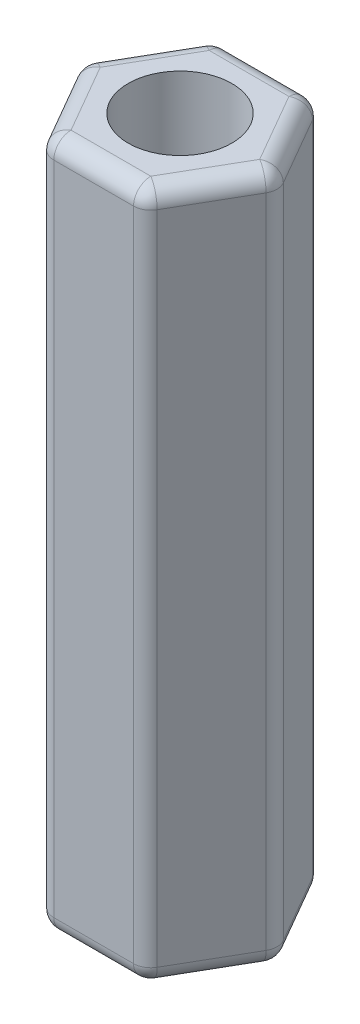
ISO-10303-21;
HEADER;
FILE_DESCRIPTION(('STEP AP214'),'2;1');
FILE_NAME('part.step','',(''),(''),'','','');
FILE_SCHEMA(('AUTOMOTIVE_DESIGN { 1 0 10303 214 1 1 1 1 }'));
ENDSEC;
DATA;
#1=APPLICATION_CONTEXT('core data for automotive mechanical design processes');
#2=APPLICATION_PROTOCOL_DEFINITION('international standard','automotive_design',2000,#1);
#3=PRODUCT_CONTEXT('',#1,'mechanical');
#4=PRODUCT('Part','Part','',(#3));
#5=PRODUCT_RELATED_PRODUCT_CATEGORY('part','',(#4));
#6=PRODUCT_DEFINITION_FORMATION('','',#4);
#7=PRODUCT_DEFINITION_CONTEXT('part definition',#1,'design');
#8=PRODUCT_DEFINITION('design','',#6,#7);
#9=PRODUCT_DEFINITION_SHAPE('','',#8);
#10=(LENGTH_UNIT() NAMED_UNIT(*) SI_UNIT(.MILLI.,.METRE.));
#11=(NAMED_UNIT(*) PLANE_ANGLE_UNIT() SI_UNIT($,.RADIAN.));
#12=(NAMED_UNIT(*) SI_UNIT($,.STERADIAN.) SOLID_ANGLE_UNIT());
#13=UNCERTAINTY_MEASURE_WITH_UNIT(LENGTH_MEASURE(1.E-05),#10,'distance_accuracy_value','');
#14=(GEOMETRIC_REPRESENTATION_CONTEXT(3) GLOBAL_UNCERTAINTY_ASSIGNED_CONTEXT((#13)) GLOBAL_UNIT_ASSIGNED_CONTEXT((#10,
#11,#12)) REPRESENTATION_CONTEXT('',''));
#15=CARTESIAN_POINT('',(0.,0.,0.));
#16=DIRECTION('',(0.,0.,1.));
#17=DIRECTION('',(1.,0.,0.));
#18=AXIS2_PLACEMENT_3D('',#15,#16,#17);
#19=CARTESIAN_POINT('',(-1.44337567297407,20.,-2.5));
#20=DIRECTION('',(0.,1.,0.));
#21=DIRECTION('',(0.,0.,1.));
#22=AXIS2_PLACEMENT_3D('',#19,#20,#21);
#23=PLANE('',#22);
#24=DIRECTION('',(-1.,0.,0.));
#25=VECTOR('',#24,1.);
#26=CARTESIAN_POINT('',(-1.44337567297406,20.,-2.));
#27=LINE('',#26,#25);
#28=CARTESIAN_POINT('',(1.15470053837925,20.,-2.));
#29=VERTEX_POINT('',#28);
#30=CARTESIAN_POINT('',(-1.15470053837925,20.,-2.));
#31=VERTEX_POINT('',#30);
#32=EDGE_CURVE('E248',#29,#31,#27,.T.);
#33=ORIENTED_EDGE('',*,*,#32,.T.);
#34=DIRECTION('',(-0.5,0.,0.866025403784439));
#35=VECTOR('',#34,1.);
#36=CARTESIAN_POINT('',(-2.45373864405591,20.,0.250000000000001));
#37=LINE('',#36,#35);
#38=CARTESIAN_POINT('',(-2.30940107675851,20.,0.));
#39=VERTEX_POINT('',#38);
#40=EDGE_CURVE('E160',#31,#39,#37,.T.);
#41=ORIENTED_EDGE('',*,*,#40,.T.);
#42=DIRECTION('',(0.5,0.,0.866025403784439));
#43=VECTOR('',#42,1.);
#44=CARTESIAN_POINT('',(-1.01036297108185,20.,2.25));
#45=LINE('',#44,#43);
#46=CARTESIAN_POINT('',(-1.15470053837925,20.,2.));
#47=VERTEX_POINT('',#46);
#48=EDGE_CURVE('E153',#39,#47,#45,.T.);
#49=ORIENTED_EDGE('',*,*,#48,.T.);
#50=DIRECTION('',(1.,0.,0.));
#51=VECTOR('',#50,1.);
#52=CARTESIAN_POINT('',(1.44337567297407,20.,2.));
#53=LINE('',#52,#51);
#54=CARTESIAN_POINT('',(1.15470053837925,20.,2.));
#55=VERTEX_POINT('',#54);
#56=EDGE_CURVE('E157',#47,#55,#53,.T.);
#57=ORIENTED_EDGE('',*,*,#56,.T.);
#58=DIRECTION('',(0.5,0.,-0.866025403784439));
#59=VECTOR('',#58,1.);
#60=CARTESIAN_POINT('',(2.45373864405591,20.,-0.249999999999999));
#61=LINE('',#60,#59);
#62=CARTESIAN_POINT('',(2.30940107675851,20.,0.));
#63=VERTEX_POINT('',#62);
#64=EDGE_CURVE('E165',#55,#63,#61,.T.);
#65=ORIENTED_EDGE('',*,*,#64,.T.);
#66=DIRECTION('',(-0.5,0.,-0.866025403784439));
#67=VECTOR('',#66,1.);
#68=CARTESIAN_POINT('',(1.01036297108185,20.,-2.25));
#69=LINE('',#68,#67);
#70=EDGE_CURVE('E246',#63,#29,#69,.T.);
#71=ORIENTED_EDGE('',*,*,#70,.T.);
#72=EDGE_LOOP('',(#33,#41,#49,#57,#65,#71));
#73=FACE_BOUND('',#72,.T.);
#74=CARTESIAN_POINT('',(0.,20.,0.));
#75=DIRECTION('',(0.,1.,0.));
#76=DIRECTION('',(0.,0.,1.));
#77=AXIS2_PLACEMENT_3D('',#74,#75,#76);
#78=CIRCLE('',#77,1.5);
#79=CARTESIAN_POINT('',(0.,20.,1.5));
#80=VERTEX_POINT('',#79);
#81=EDGE_CURVE('E176',#80,#80,#78,.T.);
#82=ORIENTED_EDGE('',*,*,#81,.F.);
#83=EDGE_LOOP('',(#82));
#84=FACE_BOUND('',#83,.T.);
#85=ADVANCED_FACE('F30',(#73,#84),#23,.T.);
#86=CARTESIAN_POINT('',(-1.44337567297407,0.,-2.5));
#87=DIRECTION('',(0.,1.,0.));
#88=DIRECTION('',(0.,0.,1.));
#89=AXIS2_PLACEMENT_3D('',#86,#87,#88);
#90=PLANE('',#89);
#91=DIRECTION('',(0.5,0.,0.866025403784439));
#92=VECTOR('',#91,1.);
#93=CARTESIAN_POINT('',(-3.17542648054295,0.,-1.5));
#94=LINE('',#93,#92);
#95=CARTESIAN_POINT('',(-1.15470053837925,0.,2.));
#96=VERTEX_POINT('',#95);
#97=CARTESIAN_POINT('',(-2.30940107675851,0.,0.));
#98=VERTEX_POINT('',#97);
#99=EDGE_CURVE('E262',#96,#98,#94,.F.);
#100=ORIENTED_EDGE('',*,*,#99,.T.);
#101=DIRECTION('',(-0.5,0.,0.866025403784439));
#102=VECTOR('',#101,1.);
#103=CARTESIAN_POINT('',(-1.01036297108185,0.,-2.25));
#104=LINE('',#103,#102);
#105=CARTESIAN_POINT('',(-1.15470053837925,0.,-2.));
#106=VERTEX_POINT('',#105);
#107=EDGE_CURVE('E271',#98,#106,#104,.F.);
#108=ORIENTED_EDGE('',*,*,#107,.T.);
#109=DIRECTION('',(-1.,0.,0.));
#110=VECTOR('',#109,1.);
#111=CARTESIAN_POINT('',(-1.44337567297407,0.,-2.));
#112=LINE('',#111,#110);
#113=CARTESIAN_POINT('',(1.15470053837925,0.,-2.));
#114=VERTEX_POINT('',#113);
#115=EDGE_CURVE('E268',#106,#114,#112,.F.);
#116=ORIENTED_EDGE('',*,*,#115,.T.);
#117=DIRECTION('',(-0.5,0.,-0.866025403784439));
#118=VECTOR('',#117,1.);
#119=CARTESIAN_POINT('',(0.288675134594814,0.,-3.5));
#120=LINE('',#119,#118);
#121=CARTESIAN_POINT('',(2.30940107675851,0.,0.));
#122=VERTEX_POINT('',#121);
#123=EDGE_CURVE('E266',#114,#122,#120,.F.);
#124=ORIENTED_EDGE('',*,*,#123,.T.);
#125=DIRECTION('',(0.5,0.,-0.866025403784439));
#126=VECTOR('',#125,1.);
#127=CARTESIAN_POINT('',(2.45373864405591,0.,-0.249999999999999));
#128=LINE('',#127,#126);
#129=CARTESIAN_POINT('',(1.15470053837925,0.,2.));
#130=VERTEX_POINT('',#129);
#131=EDGE_CURVE('E264',#122,#130,#128,.F.);
#132=ORIENTED_EDGE('',*,*,#131,.T.);
#133=DIRECTION('',(1.,0.,0.));
#134=VECTOR('',#133,1.);
#135=CARTESIAN_POINT('',(-1.44337567297407,0.,2.));
#136=LINE('',#135,#134);
#137=EDGE_CURVE('E260',#130,#96,#136,.F.);
#138=ORIENTED_EDGE('',*,*,#137,.T.);
#139=EDGE_LOOP('',(#100,#108,#116,#124,#132,#138));
#140=FACE_BOUND('',#139,.T.);
#141=CARTESIAN_POINT('',(0.,0.,0.));
#142=DIRECTION('',(0.,1.,0.));
#143=DIRECTION('',(0.,0.,1.));
#144=AXIS2_PLACEMENT_3D('',#141,#142,#143);
#145=CIRCLE('',#144,1.5);
#146=CARTESIAN_POINT('',(0.,0.,1.5));
#147=VERTEX_POINT('',#146);
#148=EDGE_CURVE('E233',#147,#147,#145,.T.);
#149=ORIENTED_EDGE('',*,*,#148,.T.);
#150=EDGE_LOOP('',(#149));
#151=FACE_BOUND('',#150,.T.);
#152=ADVANCED_FACE('F420',(#140,#151),#90,.F.);
#153=CARTESIAN_POINT('',(1.44337567297407,20.,-2.5));
#154=DIRECTION('',(0.,0.,1.));
#155=DIRECTION('',(1.,0.,0.));
#156=AXIS2_PLACEMENT_3D('',#153,#154,#155);
#157=PLANE('',#156);
#158=DIRECTION('',(-1.,0.,0.));
#159=VECTOR('',#158,1.);
#160=CARTESIAN_POINT('',(1.44337567297407,19.5,-2.5));
#161=LINE('',#160,#159);
#162=CARTESIAN_POINT('',(-1.15470053837925,19.5,-2.5));
#163=VERTEX_POINT('',#162);
#164=CARTESIAN_POINT('',(1.15470053837925,19.5,-2.5));
#165=VERTEX_POINT('',#164);
#166=EDGE_CURVE('E255',#163,#165,#161,.F.);
#167=ORIENTED_EDGE('',*,*,#166,.T.);
#168=DIRECTION('',(0.,-1.,0.));
#169=VECTOR('',#168,1.);
#170=CARTESIAN_POINT('',(1.15470053837925,20.,-2.5));
#171=LINE('',#170,#169);
#172=CARTESIAN_POINT('',(1.15470053837925,0.5,-2.5));
#173=VERTEX_POINT('',#172);
#174=EDGE_CURVE('E258',#165,#173,#171,.T.);
#175=ORIENTED_EDGE('',*,*,#174,.T.);
#176=DIRECTION('',(-1.,0.,0.));
#177=VECTOR('',#176,1.);
#178=CARTESIAN_POINT('',(1.44337567297407,0.5,-2.5));
#179=LINE('',#178,#177);
#180=CARTESIAN_POINT('',(-1.15470053837925,0.5,-2.5));
#181=VERTEX_POINT('',#180);
#182=EDGE_CURVE('E253',#173,#181,#179,.T.);
#183=ORIENTED_EDGE('',*,*,#182,.T.);
#184=DIRECTION('',(0.,-1.,0.));
#185=VECTOR('',#184,1.);
#186=CARTESIAN_POINT('',(-1.15470053837925,20.,-2.5));
#187=LINE('',#186,#185);
#188=EDGE_CURVE('E251',#181,#163,#187,.F.);
#189=ORIENTED_EDGE('',*,*,#188,.T.);
#190=EDGE_LOOP('',(#167,#175,#183,#189));
#191=FACE_BOUND('',#190,.T.);
#192=ADVANCED_FACE('F395',(#191),#157,.F.);
#193=CARTESIAN_POINT('',(-1.44337567297406,20.,-2.5));
#194=DIRECTION('',(0.866025403784438,0.,0.5));
#195=DIRECTION('',(0.5,0.,-0.866025403784439));
#196=AXIS2_PLACEMENT_3D('',#193,#194,#195);
#197=PLANE('',#196);
#198=DIRECTION('',(-0.5,0.,0.866025403784439));
#199=VECTOR('',#198,1.);
#200=CARTESIAN_POINT('',(-1.44337567297406,19.5,-2.5));
#201=LINE('',#200,#199);
#202=CARTESIAN_POINT('',(-2.74241377865073,19.5,-0.250000000000001));
#203=VERTEX_POINT('',#202);
#204=CARTESIAN_POINT('',(-1.58771324027147,19.5,-2.25));
#205=VERTEX_POINT('',#204);
#206=EDGE_CURVE('E302',#203,#205,#201,.F.);
#207=ORIENTED_EDGE('',*,*,#206,.T.);
#208=DIRECTION('',(0.,-1.,0.));
#209=VECTOR('',#208,1.);
#210=CARTESIAN_POINT('',(-1.58771324027147,20.,-2.25));
#211=LINE('',#210,#209);
#212=CARTESIAN_POINT('',(-1.58771324027147,0.5,-2.25));
#213=VERTEX_POINT('',#212);
#214=EDGE_CURVE('E304',#205,#213,#211,.T.);
#215=ORIENTED_EDGE('',*,*,#214,.T.);
#216=DIRECTION('',(-0.5,0.,0.866025403784439));
#217=VECTOR('',#216,1.);
#218=CARTESIAN_POINT('',(-1.44337567297406,0.5,-2.5));
#219=LINE('',#218,#217);
#220=CARTESIAN_POINT('',(-2.74241377865073,0.5,-0.250000000000001));
#221=VERTEX_POINT('',#220);
#222=EDGE_CURVE('E298',#213,#221,#219,.T.);
#223=ORIENTED_EDGE('',*,*,#222,.T.);
#224=DIRECTION('',(0.,-1.,0.));
#225=VECTOR('',#224,1.);
#226=CARTESIAN_POINT('',(-2.74241377865073,20.,-0.250000000000001));
#227=LINE('',#226,#225);
#228=EDGE_CURVE('E300',#221,#203,#227,.F.);
#229=ORIENTED_EDGE('',*,*,#228,.T.);
#230=EDGE_LOOP('',(#207,#215,#223,#229));
#231=FACE_BOUND('',#230,.T.);
#232=ADVANCED_FACE('F375',(#231),#197,.F.);
#233=CARTESIAN_POINT('',(-2.88675134594813,20.,0.));
#234=DIRECTION('',(0.866025403784439,0.,-0.5));
#235=DIRECTION('',(-0.5,0.,-0.866025403784439));
#236=AXIS2_PLACEMENT_3D('',#233,#234,#235);
#237=PLANE('',#236);
#238=DIRECTION('',(0.5,0.,0.866025403784439));
#239=VECTOR('',#238,1.);
#240=CARTESIAN_POINT('',(-2.88675134594813,19.5,0.));
#241=LINE('',#240,#239);
#242=CARTESIAN_POINT('',(-1.58771324027147,19.5,2.25));
#243=VERTEX_POINT('',#242);
#244=CARTESIAN_POINT('',(-2.74241377865073,19.5,0.25));
#245=VERTEX_POINT('',#244);
#246=EDGE_CURVE('E188',#243,#245,#241,.F.);
#247=ORIENTED_EDGE('',*,*,#246,.T.);
#248=DIRECTION('',(0.,-1.,0.));
#249=VECTOR('',#248,1.);
#250=CARTESIAN_POINT('',(-2.74241377865073,20.,0.25));
#251=LINE('',#250,#249);
#252=CARTESIAN_POINT('',(-2.74241377865073,0.5,0.25));
#253=VERTEX_POINT('',#252);
#254=EDGE_CURVE('E296',#245,#253,#251,.T.);
#255=ORIENTED_EDGE('',*,*,#254,.T.);
#256=DIRECTION('',(0.5,0.,0.866025403784439));
#257=VECTOR('',#256,1.);
#258=CARTESIAN_POINT('',(-2.88675134594813,0.5,0.));
#259=LINE('',#258,#257);
#260=CARTESIAN_POINT('',(-1.58771324027147,0.5,2.25));
#261=VERTEX_POINT('',#260);
#262=EDGE_CURVE('E293',#253,#261,#259,.T.);
#263=ORIENTED_EDGE('',*,*,#262,.T.);
#264=DIRECTION('',(0.,-1.,0.));
#265=VECTOR('',#264,1.);
#266=CARTESIAN_POINT('',(-1.58771324027147,20.,2.25));
#267=LINE('',#266,#265);
#268=EDGE_CURVE('E291',#261,#243,#267,.F.);
#269=ORIENTED_EDGE('',*,*,#268,.T.);
#270=EDGE_LOOP('',(#247,#255,#263,#269));
#271=FACE_BOUND('',#270,.T.);
#272=ADVANCED_FACE('F441',(#271),#237,.F.);
#273=CARTESIAN_POINT('',(-1.44337567297407,20.,2.5));
#274=DIRECTION('',(0.,0.,-1.));
#275=DIRECTION('',(-1.,0.,0.));
#276=AXIS2_PLACEMENT_3D('',#273,#274,#275);
#277=PLANE('',#276);
#278=DIRECTION('',(1.,0.,0.));
#279=VECTOR('',#278,1.);
#280=CARTESIAN_POINT('',(-1.44337567297407,19.5,2.5));
#281=LINE('',#280,#279);
#282=CARTESIAN_POINT('',(1.15470053837925,19.5,2.5));
#283=VERTEX_POINT('',#282);
#284=CARTESIAN_POINT('',(-1.15470053837925,19.5,2.5));
#285=VERTEX_POINT('',#284);
#286=EDGE_CURVE('E39',#283,#285,#281,.F.);
#287=ORIENTED_EDGE('',*,*,#286,.T.);
#288=DIRECTION('',(0.,-1.,0.));
#289=VECTOR('',#288,1.);
#290=CARTESIAN_POINT('',(-1.15470053837925,20.,2.5));
#291=LINE('',#290,#289);
#292=CARTESIAN_POINT('',(-1.15470053837925,0.5,2.5));
#293=VERTEX_POINT('',#292);
#294=EDGE_CURVE('E11',#285,#293,#291,.T.);
#295=ORIENTED_EDGE('',*,*,#294,.T.);
#296=DIRECTION('',(1.,0.,0.));
#297=VECTOR('',#296,1.);
#298=CARTESIAN_POINT('',(-1.44337567297407,0.5,2.5));
#299=LINE('',#298,#297);
#300=CARTESIAN_POINT('',(1.15470053837925,0.5,2.5));
#301=VERTEX_POINT('',#300);
#302=EDGE_CURVE('E307',#293,#301,#299,.T.);
#303=ORIENTED_EDGE('',*,*,#302,.T.);
#304=DIRECTION('',(0.,-1.,0.));
#305=VECTOR('',#304,1.);
#306=CARTESIAN_POINT('',(1.15470053837925,20.,2.5));
#307=LINE('',#306,#305);
#308=EDGE_CURVE('E50',#301,#283,#307,.F.);
#309=ORIENTED_EDGE('',*,*,#308,.T.);
#310=EDGE_LOOP('',(#287,#295,#303,#309));
#311=FACE_BOUND('',#310,.T.);
#312=ADVANCED_FACE('F437',(#311),#277,.F.);
#313=CARTESIAN_POINT('',(1.44337567297407,20.,2.5));
#314=DIRECTION('',(-0.866025403784438,0.,-0.5));
#315=DIRECTION('',(-0.5,0.,0.866025403784439));
#316=AXIS2_PLACEMENT_3D('',#313,#314,#315);
#317=PLANE('',#316);
#318=DIRECTION('',(0.,-1.,0.));
#319=VECTOR('',#318,1.);
#320=CARTESIAN_POINT('',(2.74241377865073,20.,0.250000000000002));
#321=LINE('',#320,#319);
#322=CARTESIAN_POINT('',(2.74241377865073,0.5,0.250000000000002));
#323=VERTEX_POINT('',#322);
#324=CARTESIAN_POINT('',(2.74241377865073,19.5,0.250000000000002));
#325=VERTEX_POINT('',#324);
#326=EDGE_CURVE('E286',#323,#325,#321,.F.);
#327=ORIENTED_EDGE('',*,*,#326,.T.);
#328=DIRECTION('',(0.5,0.,-0.866025403784439));
#329=VECTOR('',#328,1.);
#330=CARTESIAN_POINT('',(1.44337567297407,19.5,2.5));
#331=LINE('',#330,#329);
#332=CARTESIAN_POINT('',(1.58771324027147,19.5,2.25));
#333=VERTEX_POINT('',#332);
#334=EDGE_CURVE('E288',#325,#333,#331,.F.);
#335=ORIENTED_EDGE('',*,*,#334,.T.);
#336=DIRECTION('',(0.,-1.,0.));
#337=VECTOR('',#336,1.);
#338=CARTESIAN_POINT('',(1.58771324027147,20.,2.25));
#339=LINE('',#338,#337);
#340=CARTESIAN_POINT('',(1.58771324027147,0.5,2.25));
#341=VERTEX_POINT('',#340);
#342=EDGE_CURVE('E282',#333,#341,#339,.T.);
#343=ORIENTED_EDGE('',*,*,#342,.T.);
#344=DIRECTION('',(0.5,0.,-0.866025403784439));
#345=VECTOR('',#344,1.);
#346=CARTESIAN_POINT('',(1.44337567297407,0.5,2.5));
#347=LINE('',#346,#345);
#348=EDGE_CURVE('E284',#341,#323,#347,.T.);
#349=ORIENTED_EDGE('',*,*,#348,.T.);
#350=EDGE_LOOP('',(#327,#335,#343,#349));
#351=FACE_BOUND('',#350,.T.);
#352=ADVANCED_FACE('F433',(#351),#317,.F.);
#353=CARTESIAN_POINT('',(2.88675134594813,20.,0.));
#354=DIRECTION('',(-0.866025403784439,0.,0.5));
#355=DIRECTION('',(0.5,0.,0.866025403784439));
#356=AXIS2_PLACEMENT_3D('',#353,#354,#355);
#357=PLANE('',#356);
#358=DIRECTION('',(0.,-1.,0.));
#359=VECTOR('',#358,1.);
#360=CARTESIAN_POINT('',(1.58771324027147,20.,-2.25));
#361=LINE('',#360,#359);
#362=CARTESIAN_POINT('',(1.58771324027147,0.5,-2.25));
#363=VERTEX_POINT('',#362);
#364=CARTESIAN_POINT('',(1.58771324027147,19.5,-2.25));
#365=VERTEX_POINT('',#364);
#366=EDGE_CURVE('E277',#363,#365,#361,.F.);
#367=ORIENTED_EDGE('',*,*,#366,.T.);
#368=DIRECTION('',(-0.5,0.,-0.866025403784439));
#369=VECTOR('',#368,1.);
#370=CARTESIAN_POINT('',(2.88675134594813,19.5,0.));
#371=LINE('',#370,#369);
#372=CARTESIAN_POINT('',(2.74241377865073,19.5,-0.249999999999998));
#373=VERTEX_POINT('',#372);
#374=EDGE_CURVE('E279',#365,#373,#371,.F.);
#375=ORIENTED_EDGE('',*,*,#374,.T.);
#376=DIRECTION('',(0.,-1.,0.));
#377=VECTOR('',#376,1.);
#378=CARTESIAN_POINT('',(2.74241377865073,20.,-0.249999999999998));
#379=LINE('',#378,#377);
#380=CARTESIAN_POINT('',(2.74241377865073,0.5,-0.249999999999998));
#381=VERTEX_POINT('',#380);
#382=EDGE_CURVE('E273',#373,#381,#379,.T.);
#383=ORIENTED_EDGE('',*,*,#382,.T.);
#384=DIRECTION('',(-0.5,0.,-0.866025403784439));
#385=VECTOR('',#384,1.);
#386=CARTESIAN_POINT('',(2.88675134594813,0.5,0.));
#387=LINE('',#386,#385);
#388=EDGE_CURVE('E275',#381,#363,#387,.T.);
#389=ORIENTED_EDGE('',*,*,#388,.T.);
#390=EDGE_LOOP('',(#367,#375,#383,#389));
#391=FACE_BOUND('',#390,.T.);
#392=ADVANCED_FACE('F430',(#391),#357,.F.);
#393=CARTESIAN_POINT('',(0.,20.,0.));
#394=DIRECTION('',(0.,-1.,0.));
#395=DIRECTION('',(0.,0.,-1.));
#396=AXIS2_PLACEMENT_3D('',#393,#394,#395);
#397=CYLINDRICAL_SURFACE('',#396,1.5);
#398=ORIENTED_EDGE('',*,*,#81,.T.);
#399=EDGE_LOOP('',(#398));
#400=FACE_BOUND('',#399,.T.);
#401=ORIENTED_EDGE('',*,*,#148,.F.);
#402=EDGE_LOOP('',(#401));
#403=FACE_BOUND('',#402,.T.);
#404=ADVANCED_FACE('F428',(#400,#403),#397,.F.);
#405=CARTESIAN_POINT('',(-1.44337567297407,0.5,2.));
#406=DIRECTION('',(1.,0.,0.));
#407=DIRECTION('',(0.,0.,-1.));
#408=AXIS2_PLACEMENT_3D('',#405,#406,#407);
#409=CYLINDRICAL_SURFACE('',#408,0.5);
#410=CARTESIAN_POINT('',(1.15470053837925,0.5,2.));
#411=DIRECTION('',(1.,0.,0.));
#412=DIRECTION('',(0.,0.,-1.));
#413=AXIS2_PLACEMENT_3D('',#410,#411,#412);
#414=CIRCLE('',#413,0.5);
#415=EDGE_CURVE('E34',#301,#130,#414,.T.);
#416=ORIENTED_EDGE('',*,*,#415,.F.);
#417=ORIENTED_EDGE('',*,*,#302,.F.);
#418=CARTESIAN_POINT('',(-1.15470053837925,0.5,2.));
#419=DIRECTION('',(-1.,0.,0.));
#420=DIRECTION('',(0.,0.,1.));
#421=AXIS2_PLACEMENT_3D('',#418,#419,#420);
#422=CIRCLE('',#421,0.5);
#423=EDGE_CURVE('E225',#96,#293,#422,.T.);
#424=ORIENTED_EDGE('',*,*,#423,.F.);
#425=ORIENTED_EDGE('',*,*,#137,.F.);
#426=EDGE_LOOP('',(#416,#417,#424,#425));
#427=FACE_BOUND('',#426,.T.);
#428=ADVANCED_FACE('F32',(#427),#409,.T.);
#429=CARTESIAN_POINT('',(1.15470053837925,0.5,2.));
#430=DIRECTION('',(0.,0.,1.));
#431=DIRECTION('',(1.,0.,0.));
#432=AXIS2_PLACEMENT_3D('',#429,#430,#431);
#433=SPHERICAL_SURFACE('',#432,0.5);
#434=CARTESIAN_POINT('',(1.15470053837925,0.5,2.));
#435=DIRECTION('',(0.,-1.,0.));
#436=DIRECTION('',(0.,0.,-1.));
#437=AXIS2_PLACEMENT_3D('',#434,#435,#436);
#438=CIRCLE('',#437,0.5);
#439=EDGE_CURVE('E220',#301,#341,#438,.F.);
#440=ORIENTED_EDGE('',*,*,#439,.F.);
#441=ORIENTED_EDGE('',*,*,#415,.T.);
#442=CARTESIAN_POINT('',(1.15470053837925,0.5,2.));
#443=DIRECTION('',(-0.5,0.,0.866025403784438));
#444=DIRECTION('',(0.866025403784438,0.,0.5));
#445=AXIS2_PLACEMENT_3D('',#442,#443,#444);
#446=CIRCLE('',#445,0.5);
#447=EDGE_CURVE('E223',#341,#130,#446,.F.);
#448=ORIENTED_EDGE('',*,*,#447,.F.);
#449=EDGE_LOOP('',(#440,#441,#448));
#450=FACE_BOUND('',#449,.T.);
#451=ADVANCED_FACE('F498',(#450),#433,.T.);
#452=CARTESIAN_POINT('',(-1.15470053837925,0.5,2.));
#453=DIRECTION('',(0.,0.,1.));
#454=DIRECTION('',(1.,0.,0.));
#455=AXIS2_PLACEMENT_3D('',#452,#453,#454);
#456=SPHERICAL_SURFACE('',#455,0.5);
#457=CARTESIAN_POINT('',(-1.15470053837925,0.5,2.));
#458=DIRECTION('',(0.500000000000001,0.,0.866025403784438));
#459=DIRECTION('',(0.866025403784438,0.,-0.500000000000001));
#460=AXIS2_PLACEMENT_3D('',#457,#458,#459);
#461=CIRCLE('',#460,0.5);
#462=EDGE_CURVE('E215',#96,#261,#461,.F.);
#463=ORIENTED_EDGE('',*,*,#462,.F.);
#464=ORIENTED_EDGE('',*,*,#423,.T.);
#465=CARTESIAN_POINT('',(-1.15470053837925,0.5,2.));
#466=DIRECTION('',(0.,-1.,0.));
#467=DIRECTION('',(0.,0.,-1.));
#468=AXIS2_PLACEMENT_3D('',#465,#466,#467);
#469=CIRCLE('',#468,0.5);
#470=EDGE_CURVE('E218',#261,#293,#469,.F.);
#471=ORIENTED_EDGE('',*,*,#470,.F.);
#472=EDGE_LOOP('',(#463,#464,#471));
#473=FACE_BOUND('',#472,.T.);
#474=ADVANCED_FACE('F533',(#473),#456,.T.);
#475=CARTESIAN_POINT('',(1.01036297108185,0.5,2.25));
#476=DIRECTION('',(0.5,0.,-0.866025403784439));
#477=DIRECTION('',(-0.866025403784438,0.,-0.5));
#478=AXIS2_PLACEMENT_3D('',#475,#476,#477);
#479=CYLINDRICAL_SURFACE('',#478,0.5);
#480=ORIENTED_EDGE('',*,*,#447,.T.);
#481=ORIENTED_EDGE('',*,*,#131,.F.);
#482=CARTESIAN_POINT('',(2.30940107675851,0.5,0.));
#483=DIRECTION('',(0.5,0.,-0.866025403784438));
#484=DIRECTION('',(-0.866025403784438,0.,-0.5));
#485=AXIS2_PLACEMENT_3D('',#482,#483,#484);
#486=CIRCLE('',#485,0.5);
#487=EDGE_CURVE('E212',#323,#122,#486,.T.);
#488=ORIENTED_EDGE('',*,*,#487,.F.);
#489=ORIENTED_EDGE('',*,*,#348,.F.);
#490=EDGE_LOOP('',(#480,#481,#488,#489));
#491=FACE_BOUND('',#490,.T.);
#492=ADVANCED_FACE('F512',(#491),#479,.T.);
#493=CARTESIAN_POINT('',(1.15470053837925,20.,2.));
#494=DIRECTION('',(0.,-1.,0.));
#495=DIRECTION('',(0.,0.,-1.));
#496=AXIS2_PLACEMENT_3D('',#493,#494,#495);
#497=CYLINDRICAL_SURFACE('',#496,0.5);
#498=ORIENTED_EDGE('',*,*,#439,.T.);
#499=ORIENTED_EDGE('',*,*,#342,.F.);
#500=CARTESIAN_POINT('',(1.15470053837925,19.5,2.));
#501=DIRECTION('',(0.,1.,0.));
#502=DIRECTION('',(0.,0.,1.));
#503=AXIS2_PLACEMENT_3D('',#500,#501,#502);
#504=CIRCLE('',#503,0.5);
#505=EDGE_CURVE('E209',#283,#333,#504,.T.);
#506=ORIENTED_EDGE('',*,*,#505,.F.);
#507=ORIENTED_EDGE('',*,*,#308,.F.);
#508=EDGE_LOOP('',(#498,#499,#506,#507));
#509=FACE_BOUND('',#508,.T.);
#510=ADVANCED_FACE('F503',(#509),#497,.T.);
#511=CARTESIAN_POINT('',(-1.44337567297407,19.5,2.));
#512=DIRECTION('',(-1.,0.,0.));
#513=DIRECTION('',(0.,0.,1.));
#514=AXIS2_PLACEMENT_3D('',#511,#512,#513);
#515=CYLINDRICAL_SURFACE('',#514,0.5);
#516=CARTESIAN_POINT('',(-1.15470053837925,19.5,2.));
#517=DIRECTION('',(-1.,0.,0.));
#518=DIRECTION('',(0.,0.,1.));
#519=AXIS2_PLACEMENT_3D('',#516,#517,#518);
#520=CIRCLE('',#519,0.5);
#521=EDGE_CURVE('E171',#285,#47,#520,.T.);
#522=ORIENTED_EDGE('',*,*,#521,.F.);
#523=ORIENTED_EDGE('',*,*,#286,.F.);
#524=CARTESIAN_POINT('',(1.15470053837925,19.5,2.));
#525=DIRECTION('',(1.,0.,0.));
#526=DIRECTION('',(0.,0.,-1.));
#527=AXIS2_PLACEMENT_3D('',#524,#525,#526);
#528=CIRCLE('',#527,0.5);
#529=EDGE_CURVE('E174',#55,#283,#528,.T.);
#530=ORIENTED_EDGE('',*,*,#529,.F.);
#531=ORIENTED_EDGE('',*,*,#56,.F.);
#532=EDGE_LOOP('',(#522,#523,#530,#531));
#533=FACE_BOUND('',#532,.T.);
#534=ADVANCED_FACE('F170',(#533),#515,.T.);
#535=CARTESIAN_POINT('',(-1.15470053837925,20.,2.));
#536=DIRECTION('',(0.,-1.,0.));
#537=DIRECTION('',(0.,0.,-1.));
#538=AXIS2_PLACEMENT_3D('',#535,#536,#537);
#539=CYLINDRICAL_SURFACE('',#538,0.5);
#540=ORIENTED_EDGE('',*,*,#470,.T.);
#541=ORIENTED_EDGE('',*,*,#294,.F.);
#542=CARTESIAN_POINT('',(-1.15470053837925,19.5,2.));
#543=DIRECTION('',(0.,1.,0.));
#544=DIRECTION('',(0.,0.,1.));
#545=AXIS2_PLACEMENT_3D('',#542,#543,#544);
#546=CIRCLE('',#545,0.5);
#547=EDGE_CURVE('E184',#243,#285,#546,.T.);
#548=ORIENTED_EDGE('',*,*,#547,.F.);
#549=ORIENTED_EDGE('',*,*,#268,.F.);
#550=EDGE_LOOP('',(#540,#541,#548,#549));
#551=FACE_BOUND('',#550,.T.);
#552=ADVANCED_FACE('F496',(#551),#539,.T.);
#553=CARTESIAN_POINT('',(-2.45373864405591,0.5,-0.250000000000001));
#554=DIRECTION('',(0.5,0.,0.866025403784439));
#555=DIRECTION('',(0.866025403784439,0.,-0.5));
#556=AXIS2_PLACEMENT_3D('',#553,#554,#555);
#557=CYLINDRICAL_SURFACE('',#556,0.5);
#558=ORIENTED_EDGE('',*,*,#462,.T.);
#559=ORIENTED_EDGE('',*,*,#262,.F.);
#560=CARTESIAN_POINT('',(-2.30940107675851,0.5,0.));
#561=DIRECTION('',(-0.5,0.,-0.866025403784438));
#562=DIRECTION('',(-0.866025403784438,0.,0.5));
#563=AXIS2_PLACEMENT_3D('',#560,#561,#562);
#564=CIRCLE('',#563,0.5);
#565=EDGE_CURVE('E204',#98,#253,#564,.T.);
#566=ORIENTED_EDGE('',*,*,#565,.F.);
#567=ORIENTED_EDGE('',*,*,#99,.F.);
#568=EDGE_LOOP('',(#558,#559,#566,#567));
#569=FACE_BOUND('',#568,.T.);
#570=ADVANCED_FACE('F493',(#569),#557,.T.);
#571=CARTESIAN_POINT('',(2.30940107675851,0.5,0.));
#572=DIRECTION('',(0.,0.,1.));
#573=DIRECTION('',(1.,0.,0.));
#574=AXIS2_PLACEMENT_3D('',#571,#572,#573);
#575=SPHERICAL_SURFACE('',#574,0.5);
#576=CARTESIAN_POINT('',(2.30940107675851,0.5,0.));
#577=DIRECTION('',(0.,-1.,0.));
#578=DIRECTION('',(0.,0.,-1.));
#579=AXIS2_PLACEMENT_3D('',#576,#577,#578);
#580=CIRCLE('',#579,0.5);
#581=EDGE_CURVE('E192',#323,#381,#580,.F.);
#582=ORIENTED_EDGE('',*,*,#581,.F.);
#583=ORIENTED_EDGE('',*,*,#487,.T.);
#584=CARTESIAN_POINT('',(2.30940107675851,0.5,0.));
#585=DIRECTION('',(0.5,0.,0.866025403784439));
#586=DIRECTION('',(0.866025403784439,0.,-0.5));
#587=AXIS2_PLACEMENT_3D('',#584,#585,#586);
#588=CIRCLE('',#587,0.5);
#589=EDGE_CURVE('E201',#381,#122,#588,.F.);
#590=ORIENTED_EDGE('',*,*,#589,.F.);
#591=EDGE_LOOP('',(#582,#583,#590));
#592=FACE_BOUND('',#591,.T.);
#593=ADVANCED_FACE('F514',(#592),#575,.T.);
#594=CARTESIAN_POINT('',(1.15470053837925,19.5,2.));
#595=DIRECTION('',(0.,0.,1.));
#596=DIRECTION('',(1.,0.,0.));
#597=AXIS2_PLACEMENT_3D('',#594,#595,#596);
#598=SPHERICAL_SURFACE('',#597,0.5);
#599=ORIENTED_EDGE('',*,*,#529,.T.);
#600=ORIENTED_EDGE('',*,*,#505,.T.);
#601=CARTESIAN_POINT('',(1.15470053837925,19.5,2.));
#602=DIRECTION('',(-0.5,0.,0.866025403784438));
#603=DIRECTION('',(0.866025403784439,0.,0.5));
#604=AXIS2_PLACEMENT_3D('',#601,#602,#603);
#605=CIRCLE('',#604,0.5);
#606=EDGE_CURVE('E189',#55,#333,#605,.F.);
#607=ORIENTED_EDGE('',*,*,#606,.F.);
#608=EDGE_LOOP('',(#599,#600,#607));
#609=FACE_BOUND('',#608,.T.);
#610=ADVANCED_FACE('F505',(#609),#598,.T.);
#611=CARTESIAN_POINT('',(-1.15470053837925,19.5,2.));
#612=DIRECTION('',(0.,0.,1.));
#613=DIRECTION('',(1.,0.,0.));
#614=AXIS2_PLACEMENT_3D('',#611,#612,#613);
#615=SPHERICAL_SURFACE('',#614,0.5);
#616=ORIENTED_EDGE('',*,*,#547,.T.);
#617=ORIENTED_EDGE('',*,*,#521,.T.);
#618=CARTESIAN_POINT('',(-1.15470053837925,19.5,2.));
#619=DIRECTION('',(0.5,0.,0.866025403784439));
#620=DIRECTION('',(0.866025403784439,0.,-0.5));
#621=AXIS2_PLACEMENT_3D('',#618,#619,#620);
#622=CIRCLE('',#621,0.5);
#623=EDGE_CURVE('E181',#243,#47,#622,.F.);
#624=ORIENTED_EDGE('',*,*,#623,.F.);
#625=EDGE_LOOP('',(#616,#617,#624));
#626=FACE_BOUND('',#625,.T.);
#627=ADVANCED_FACE('F180',(#626),#615,.T.);
#628=CARTESIAN_POINT('',(-2.30940107675851,0.5,0.));
#629=DIRECTION('',(0.,0.,1.));
#630=DIRECTION('',(1.,0.,0.));
#631=AXIS2_PLACEMENT_3D('',#628,#629,#630);
#632=SPHERICAL_SURFACE('',#631,0.5);
#633=CARTESIAN_POINT('',(-2.30940107675851,0.5,0.));
#634=DIRECTION('',(-0.5,0.,0.866025403784438));
#635=DIRECTION('',(0.866025403784438,0.,0.5));
#636=AXIS2_PLACEMENT_3D('',#633,#634,#635);
#637=CIRCLE('',#636,0.5);
#638=EDGE_CURVE('E195',#98,#221,#637,.F.);
#639=ORIENTED_EDGE('',*,*,#638,.F.);
#640=ORIENTED_EDGE('',*,*,#565,.T.);
#641=CARTESIAN_POINT('',(-2.30940107675851,0.5,0.));
#642=DIRECTION('',(0.,-1.,0.));
#643=DIRECTION('',(0.,0.,-1.));
#644=AXIS2_PLACEMENT_3D('',#641,#642,#643);
#645=CIRCLE('',#644,0.5);
#646=EDGE_CURVE('E190',#221,#253,#645,.F.);
#647=ORIENTED_EDGE('',*,*,#646,.F.);
#648=EDGE_LOOP('',(#639,#640,#647));
#649=FACE_BOUND('',#648,.T.);
#650=ADVANCED_FACE('F367',(#649),#632,.T.);
#651=CARTESIAN_POINT('',(2.45373864405591,0.5,0.250000000000002));
#652=DIRECTION('',(-0.5,0.,-0.866025403784439));
#653=DIRECTION('',(-0.866025403784439,0.,0.5));
#654=AXIS2_PLACEMENT_3D('',#651,#652,#653);
#655=CYLINDRICAL_SURFACE('',#654,0.5);
#656=ORIENTED_EDGE('',*,*,#589,.T.);
#657=ORIENTED_EDGE('',*,*,#123,.F.);
#658=CARTESIAN_POINT('',(1.15470053837925,0.5,-2.));
#659=DIRECTION('',(-0.5,0.,-0.866025403784438));
#660=DIRECTION('',(-0.866025403784439,0.,0.5));
#661=AXIS2_PLACEMENT_3D('',#658,#659,#660);
#662=CIRCLE('',#661,0.5);
#663=EDGE_CURVE('E353',#363,#114,#662,.T.);
#664=ORIENTED_EDGE('',*,*,#663,.F.);
#665=ORIENTED_EDGE('',*,*,#388,.F.);
#666=EDGE_LOOP('',(#656,#657,#664,#665));
#667=FACE_BOUND('',#666,.T.);
#668=ADVANCED_FACE('F487',(#667),#655,.T.);
#669=CARTESIAN_POINT('',(2.30940107675851,20.,0.));
#670=DIRECTION('',(0.,-1.,0.));
#671=DIRECTION('',(0.,0.,-1.));
#672=AXIS2_PLACEMENT_3D('',#669,#670,#671);
#673=CYLINDRICAL_SURFACE('',#672,0.5);
#674=ORIENTED_EDGE('',*,*,#581,.T.);
#675=ORIENTED_EDGE('',*,*,#382,.F.);
#676=CARTESIAN_POINT('',(2.30940107675851,19.5,0.));
#677=DIRECTION('',(0.,1.,0.));
#678=DIRECTION('',(0.,0.,1.));
#679=AXIS2_PLACEMENT_3D('',#676,#677,#678);
#680=CIRCLE('',#679,0.5);
#681=EDGE_CURVE('E350',#325,#373,#680,.T.);
#682=ORIENTED_EDGE('',*,*,#681,.F.);
#683=ORIENTED_EDGE('',*,*,#326,.F.);
#684=EDGE_LOOP('',(#674,#675,#682,#683));
#685=FACE_BOUND('',#684,.T.);
#686=ADVANCED_FACE('F476',(#685),#673,.T.);
#687=CARTESIAN_POINT('',(2.45373864405591,19.5,-0.249999999999999));
#688=DIRECTION('',(-0.5,0.,0.866025403784439));
#689=DIRECTION('',(0.866025403784438,0.,0.5));
#690=AXIS2_PLACEMENT_3D('',#687,#688,#689);
#691=CYLINDRICAL_SURFACE('',#690,0.5);
#692=ORIENTED_EDGE('',*,*,#606,.T.);
#693=ORIENTED_EDGE('',*,*,#334,.F.);
#694=CARTESIAN_POINT('',(2.30940107675851,19.5,0.));
#695=DIRECTION('',(0.500000000000001,0.,-0.866025403784438));
#696=DIRECTION('',(-0.866025403784438,0.,-0.500000000000001));
#697=AXIS2_PLACEMENT_3D('',#694,#695,#696);
#698=CIRCLE('',#697,0.5);
#699=EDGE_CURVE('E347',#63,#325,#698,.T.);
#700=ORIENTED_EDGE('',*,*,#699,.F.);
#701=ORIENTED_EDGE('',*,*,#64,.F.);
#702=EDGE_LOOP('',(#692,#693,#700,#701));
#703=FACE_BOUND('',#702,.T.);
#704=ADVANCED_FACE('F509',(#703),#691,.T.);
#705=CARTESIAN_POINT('',(-3.17542648054295,19.5,-1.5));
#706=DIRECTION('',(-0.5,0.,-0.866025403784439));
#707=DIRECTION('',(-0.866025403784439,0.,0.5));
#708=AXIS2_PLACEMENT_3D('',#705,#706,#707);
#709=CYLINDRICAL_SURFACE('',#708,0.5);
#710=ORIENTED_EDGE('',*,*,#623,.T.);
#711=ORIENTED_EDGE('',*,*,#48,.F.);
#712=CARTESIAN_POINT('',(-2.30940107675851,19.5,0.));
#713=DIRECTION('',(-0.5,0.,-0.866025403784438));
#714=DIRECTION('',(-0.866025403784439,0.,0.5));
#715=AXIS2_PLACEMENT_3D('',#712,#713,#714);
#716=CIRCLE('',#715,0.5);
#717=EDGE_CURVE('E345',#245,#39,#716,.T.);
#718=ORIENTED_EDGE('',*,*,#717,.F.);
#719=ORIENTED_EDGE('',*,*,#246,.F.);
#720=EDGE_LOOP('',(#710,#711,#718,#719));
#721=FACE_BOUND('',#720,.T.);
#722=ADVANCED_FACE('F186',(#721),#709,.T.);
#723=CARTESIAN_POINT('',(-2.30940107675851,20.,0.));
#724=DIRECTION('',(0.,-1.,0.));
#725=DIRECTION('',(0.,0.,-1.));
#726=AXIS2_PLACEMENT_3D('',#723,#724,#725);
#727=CYLINDRICAL_SURFACE('',#726,0.5);
#728=ORIENTED_EDGE('',*,*,#646,.T.);
#729=ORIENTED_EDGE('',*,*,#254,.F.);
#730=CARTESIAN_POINT('',(-2.30940107675851,19.5,0.));
#731=DIRECTION('',(0.,1.,0.));
#732=DIRECTION('',(0.,0.,1.));
#733=AXIS2_PLACEMENT_3D('',#730,#731,#732);
#734=CIRCLE('',#733,0.5);
#735=EDGE_CURVE('E343',#203,#245,#734,.T.);
#736=ORIENTED_EDGE('',*,*,#735,.F.);
#737=ORIENTED_EDGE('',*,*,#228,.F.);
#738=EDGE_LOOP('',(#728,#729,#736,#737));
#739=FACE_BOUND('',#738,.T.);
#740=ADVANCED_FACE('F372',(#739),#727,.T.);
#741=CARTESIAN_POINT('',(-1.01036297108185,0.5,-2.25));
#742=DIRECTION('',(-0.5,0.,0.866025403784439));
#743=DIRECTION('',(0.866025403784438,0.,0.5));
#744=AXIS2_PLACEMENT_3D('',#741,#742,#743);
#745=CYLINDRICAL_SURFACE('',#744,0.5);
#746=ORIENTED_EDGE('',*,*,#638,.T.);
#747=ORIENTED_EDGE('',*,*,#222,.F.);
#748=CARTESIAN_POINT('',(-1.15470053837925,0.5,-2.));
#749=DIRECTION('',(0.5,0.,-0.866025403784438));
#750=DIRECTION('',(-0.866025403784438,0.,-0.5));
#751=AXIS2_PLACEMENT_3D('',#748,#749,#750);
#752=CIRCLE('',#751,0.5);
#753=EDGE_CURVE('E340',#106,#213,#752,.T.);
#754=ORIENTED_EDGE('',*,*,#753,.F.);
#755=ORIENTED_EDGE('',*,*,#107,.F.);
#756=EDGE_LOOP('',(#746,#747,#754,#755));
#757=FACE_BOUND('',#756,.T.);
#758=ADVANCED_FACE('F363',(#757),#745,.T.);
#759=CARTESIAN_POINT('',(1.44337567297407,0.5,-2.));
#760=DIRECTION('',(-1.,0.,0.));
#761=DIRECTION('',(0.,0.,1.));
#762=AXIS2_PLACEMENT_3D('',#759,#760,#761);
#763=CYLINDRICAL_SURFACE('',#762,0.5);
#764=CARTESIAN_POINT('',(1.15470053837925,0.5,-2.));
#765=DIRECTION('',(1.,0.,0.));
#766=DIRECTION('',(0.,0.,-1.));
#767=AXIS2_PLACEMENT_3D('',#764,#765,#766);
#768=CIRCLE('',#767,0.5);
#769=EDGE_CURVE('E355',#114,#173,#768,.T.);
#770=ORIENTED_EDGE('',*,*,#769,.F.);
#771=ORIENTED_EDGE('',*,*,#115,.F.);
#772=CARTESIAN_POINT('',(-1.15470053837925,0.5,-2.));
#773=DIRECTION('',(-1.,0.,0.));
#774=DIRECTION('',(0.,0.,1.));
#775=AXIS2_PLACEMENT_3D('',#772,#773,#774);
#776=CIRCLE('',#775,0.5);
#777=EDGE_CURVE('E337',#181,#106,#776,.T.);
#778=ORIENTED_EDGE('',*,*,#777,.F.);
#779=ORIENTED_EDGE('',*,*,#182,.F.);
#780=EDGE_LOOP('',(#770,#771,#778,#779));
#781=FACE_BOUND('',#780,.T.);
#782=ADVANCED_FACE('F402',(#781),#763,.T.);
#783=CARTESIAN_POINT('',(1.15470053837925,0.5,-2.));
#784=DIRECTION('',(0.,0.,1.));
#785=DIRECTION('',(1.,0.,0.));
#786=AXIS2_PLACEMENT_3D('',#783,#784,#785);
#787=SPHERICAL_SURFACE('',#786,0.5);
#788=ORIENTED_EDGE('',*,*,#663,.T.);
#789=ORIENTED_EDGE('',*,*,#769,.T.);
#790=CARTESIAN_POINT('',(1.15470053837925,0.5,-2.));
#791=DIRECTION('',(0.,-1.,0.));
#792=DIRECTION('',(0.,0.,-1.));
#793=AXIS2_PLACEMENT_3D('',#790,#791,#792);
#794=CIRCLE('',#793,0.5);
#795=EDGE_CURVE('E334',#363,#173,#794,.F.);
#796=ORIENTED_EDGE('',*,*,#795,.F.);
#797=EDGE_LOOP('',(#788,#789,#796));
#798=FACE_BOUND('',#797,.T.);
#799=ADVANCED_FACE('F484',(#798),#787,.T.);
#800=CARTESIAN_POINT('',(2.30940107675851,19.5,0.));
#801=DIRECTION('',(0.,0.,1.));
#802=DIRECTION('',(1.,0.,0.));
#803=AXIS2_PLACEMENT_3D('',#800,#801,#802);
#804=SPHERICAL_SURFACE('',#803,0.5);
#805=ORIENTED_EDGE('',*,*,#699,.T.);
#806=ORIENTED_EDGE('',*,*,#681,.T.);
#807=CARTESIAN_POINT('',(2.30940107675851,19.5,0.));
#808=DIRECTION('',(0.5,0.,0.866025403784438));
#809=DIRECTION('',(0.866025403784439,0.,-0.5));
#810=AXIS2_PLACEMENT_3D('',#807,#808,#809);
#811=CIRCLE('',#810,0.5);
#812=EDGE_CURVE('E332',#63,#373,#811,.F.);
#813=ORIENTED_EDGE('',*,*,#812,.F.);
#814=EDGE_LOOP('',(#805,#806,#813));
#815=FACE_BOUND('',#814,.T.);
#816=ADVANCED_FACE('F416',(#815),#804,.T.);
#817=CARTESIAN_POINT('',(-2.30940107675851,19.5,0.));
#818=DIRECTION('',(0.,0.,1.));
#819=DIRECTION('',(1.,0.,0.));
#820=AXIS2_PLACEMENT_3D('',#817,#818,#819);
#821=SPHERICAL_SURFACE('',#820,0.5);
#822=ORIENTED_EDGE('',*,*,#735,.T.);
#823=ORIENTED_EDGE('',*,*,#717,.T.);
#824=CARTESIAN_POINT('',(-2.30940107675851,19.5,0.));
#825=DIRECTION('',(-0.500000000000001,0.,0.866025403784438));
#826=DIRECTION('',(0.866025403784438,0.,0.500000000000001));
#827=AXIS2_PLACEMENT_3D('',#824,#825,#826);
#828=CIRCLE('',#827,0.5);
#829=EDGE_CURVE('E329',#203,#39,#828,.F.);
#830=ORIENTED_EDGE('',*,*,#829,.F.);
#831=EDGE_LOOP('',(#822,#823,#830));
#832=FACE_BOUND('',#831,.T.);
#833=ADVANCED_FACE('F407',(#832),#821,.T.);
#834=CARTESIAN_POINT('',(-1.15470053837925,0.5,-2.));
#835=DIRECTION('',(0.,0.,1.));
#836=DIRECTION('',(1.,0.,0.));
#837=AXIS2_PLACEMENT_3D('',#834,#835,#836);
#838=SPHERICAL_SURFACE('',#837,0.5);
#839=ORIENTED_EDGE('',*,*,#777,.T.);
#840=ORIENTED_EDGE('',*,*,#753,.T.);
#841=CARTESIAN_POINT('',(-1.15470053837925,0.5,-2.));
#842=DIRECTION('',(0.,-1.,0.));
#843=DIRECTION('',(0.,0.,-1.));
#844=AXIS2_PLACEMENT_3D('',#841,#842,#843);
#845=CIRCLE('',#844,0.5);
#846=EDGE_CURVE('E327',#181,#213,#845,.F.);
#847=ORIENTED_EDGE('',*,*,#846,.F.);
#848=EDGE_LOOP('',(#839,#840,#847));
#849=FACE_BOUND('',#848,.T.);
#850=ADVANCED_FACE('F404',(#849),#838,.T.);
#851=CARTESIAN_POINT('',(1.15470053837925,20.,-2.));
#852=DIRECTION('',(0.,-1.,0.));
#853=DIRECTION('',(0.,0.,-1.));
#854=AXIS2_PLACEMENT_3D('',#851,#852,#853);
#855=CYLINDRICAL_SURFACE('',#854,0.5);
#856=ORIENTED_EDGE('',*,*,#795,.T.);
#857=ORIENTED_EDGE('',*,*,#174,.F.);
#858=CARTESIAN_POINT('',(1.15470053837925,19.5,-2.));
#859=DIRECTION('',(0.,1.,0.));
#860=DIRECTION('',(0.,0.,1.));
#861=AXIS2_PLACEMENT_3D('',#858,#859,#860);
#862=CIRCLE('',#861,0.5);
#863=EDGE_CURVE('E324',#365,#165,#862,.T.);
#864=ORIENTED_EDGE('',*,*,#863,.F.);
#865=ORIENTED_EDGE('',*,*,#366,.F.);
#866=EDGE_LOOP('',(#856,#857,#864,#865));
#867=FACE_BOUND('',#866,.T.);
#868=ADVANCED_FACE('F406',(#867),#855,.T.);
#869=CARTESIAN_POINT('',(0.288675134594814,19.5,-3.5));
#870=DIRECTION('',(0.5,0.,0.866025403784439));
#871=DIRECTION('',(0.866025403784439,0.,-0.5));
#872=AXIS2_PLACEMENT_3D('',#869,#870,#871);
#873=CYLINDRICAL_SURFACE('',#872,0.5);
#874=ORIENTED_EDGE('',*,*,#812,.T.);
#875=ORIENTED_EDGE('',*,*,#374,.F.);
#876=CARTESIAN_POINT('',(1.15470053837925,19.5,-2.));
#877=DIRECTION('',(-0.5,0.,-0.866025403784439));
#878=DIRECTION('',(-0.866025403784439,0.,0.5));
#879=AXIS2_PLACEMENT_3D('',#876,#877,#878);
#880=CIRCLE('',#879,0.5);
#881=EDGE_CURVE('E321',#29,#365,#880,.T.);
#882=ORIENTED_EDGE('',*,*,#881,.F.);
#883=ORIENTED_EDGE('',*,*,#70,.F.);
#884=EDGE_LOOP('',(#874,#875,#882,#883));
#885=FACE_BOUND('',#884,.T.);
#886=ADVANCED_FACE('F413',(#885),#873,.T.);
#887=CARTESIAN_POINT('',(-1.01036297108185,19.5,-2.25));
#888=DIRECTION('',(0.5,0.,-0.866025403784439));
#889=DIRECTION('',(-0.866025403784438,0.,-0.5));
#890=AXIS2_PLACEMENT_3D('',#887,#888,#889);
#891=CYLINDRICAL_SURFACE('',#890,0.5);
#892=ORIENTED_EDGE('',*,*,#829,.T.);
#893=ORIENTED_EDGE('',*,*,#40,.F.);
#894=CARTESIAN_POINT('',(-1.15470053837925,19.5,-2.));
#895=DIRECTION('',(0.500000000000001,0.,-0.866025403784438));
#896=DIRECTION('',(-0.866025403784438,0.,-0.500000000000001));
#897=AXIS2_PLACEMENT_3D('',#894,#895,#896);
#898=CIRCLE('',#897,0.5);
#899=EDGE_CURVE('E318',#205,#31,#898,.T.);
#900=ORIENTED_EDGE('',*,*,#899,.F.);
#901=ORIENTED_EDGE('',*,*,#206,.F.);
#902=EDGE_LOOP('',(#892,#893,#900,#901));
#903=FACE_BOUND('',#902,.T.);
#904=ADVANCED_FACE('F386',(#903),#891,.T.);
#905=CARTESIAN_POINT('',(-1.15470053837925,20.,-2.));
#906=DIRECTION('',(0.,-1.,0.));
#907=DIRECTION('',(0.,0.,-1.));
#908=AXIS2_PLACEMENT_3D('',#905,#906,#907);
#909=CYLINDRICAL_SURFACE('',#908,0.5);
#910=ORIENTED_EDGE('',*,*,#846,.T.);
#911=ORIENTED_EDGE('',*,*,#214,.F.);
#912=CARTESIAN_POINT('',(-1.15470053837925,19.5,-2.));
#913=DIRECTION('',(0.,1.,0.));
#914=DIRECTION('',(0.,0.,1.));
#915=AXIS2_PLACEMENT_3D('',#912,#913,#914);
#916=CIRCLE('',#915,0.5);
#917=EDGE_CURVE('E315',#163,#205,#916,.T.);
#918=ORIENTED_EDGE('',*,*,#917,.F.);
#919=ORIENTED_EDGE('',*,*,#188,.F.);
#920=EDGE_LOOP('',(#910,#911,#918,#919));
#921=FACE_BOUND('',#920,.T.);
#922=ADVANCED_FACE('F381',(#921),#909,.T.);
#923=CARTESIAN_POINT('',(1.15470053837925,19.5,-2.));
#924=DIRECTION('',(0.,0.,1.));
#925=DIRECTION('',(1.,0.,0.));
#926=AXIS2_PLACEMENT_3D('',#923,#924,#925);
#927=SPHERICAL_SURFACE('',#926,0.5);
#928=ORIENTED_EDGE('',*,*,#881,.T.);
#929=ORIENTED_EDGE('',*,*,#863,.T.);
#930=CARTESIAN_POINT('',(1.15470053837925,19.5,-2.));
#931=DIRECTION('',(1.,0.,0.));
#932=DIRECTION('',(0.,1.,0.));
#933=AXIS2_PLACEMENT_3D('',#930,#931,#932);
#934=CIRCLE('',#933,0.5);
#935=EDGE_CURVE('E313',#29,#165,#934,.F.);
#936=ORIENTED_EDGE('',*,*,#935,.F.);
#937=EDGE_LOOP('',(#928,#929,#936));
#938=FACE_BOUND('',#937,.T.);
#939=ADVANCED_FACE('F453',(#938),#927,.T.);
#940=CARTESIAN_POINT('',(-1.15470053837925,19.5,-2.));
#941=DIRECTION('',(0.,0.,1.));
#942=DIRECTION('',(1.,0.,0.));
#943=AXIS2_PLACEMENT_3D('',#940,#941,#942);
#944=SPHERICAL_SURFACE('',#943,0.5);
#945=ORIENTED_EDGE('',*,*,#917,.T.);
#946=ORIENTED_EDGE('',*,*,#899,.T.);
#947=CARTESIAN_POINT('',(-1.15470053837925,19.5,-2.));
#948=DIRECTION('',(-1.,0.,0.));
#949=DIRECTION('',(0.,0.,1.));
#950=AXIS2_PLACEMENT_3D('',#947,#948,#949);
#951=CIRCLE('',#950,0.5);
#952=EDGE_CURVE('E311',#163,#31,#951,.F.);
#953=ORIENTED_EDGE('',*,*,#952,.F.);
#954=EDGE_LOOP('',(#945,#946,#953));
#955=FACE_BOUND('',#954,.T.);
#956=ADVANCED_FACE('F389',(#955),#944,.T.);
#957=CARTESIAN_POINT('',(-1.44337567297407,19.5,-2.));
#958=DIRECTION('',(1.,0.,0.));
#959=DIRECTION('',(0.,0.,-1.));
#960=AXIS2_PLACEMENT_3D('',#957,#958,#959);
#961=CYLINDRICAL_SURFACE('',#960,0.5);
#962=ORIENTED_EDGE('',*,*,#935,.T.);
#963=ORIENTED_EDGE('',*,*,#166,.F.);
#964=ORIENTED_EDGE('',*,*,#952,.T.);
#965=ORIENTED_EDGE('',*,*,#32,.F.);
#966=EDGE_LOOP('',(#962,#963,#964,#965));
#967=FACE_BOUND('',#966,.T.);
#968=ADVANCED_FACE('F392',(#967),#961,.T.);
#969=CLOSED_SHELL('',(#85,#152,#192,#232,#272,#312,#352,#392,#404,#428,#451,#474,#492,#510,#534,
#552,#570,#593,#610,#627,#650,#668,#686,#704,#722,#740,#758,#782,#799,#816,#833,#850,#868,#886,
#904,#922,#939,#956,#968));
#970=MANIFOLD_SOLID_BREP('B2',#969);
#971=ADVANCED_BREP_SHAPE_REPRESENTATION('',(#18,#970),#14);
#972=SHAPE_DEFINITION_REPRESENTATION(#9,#971);
ENDSEC;
END-ISO-10303-21;
